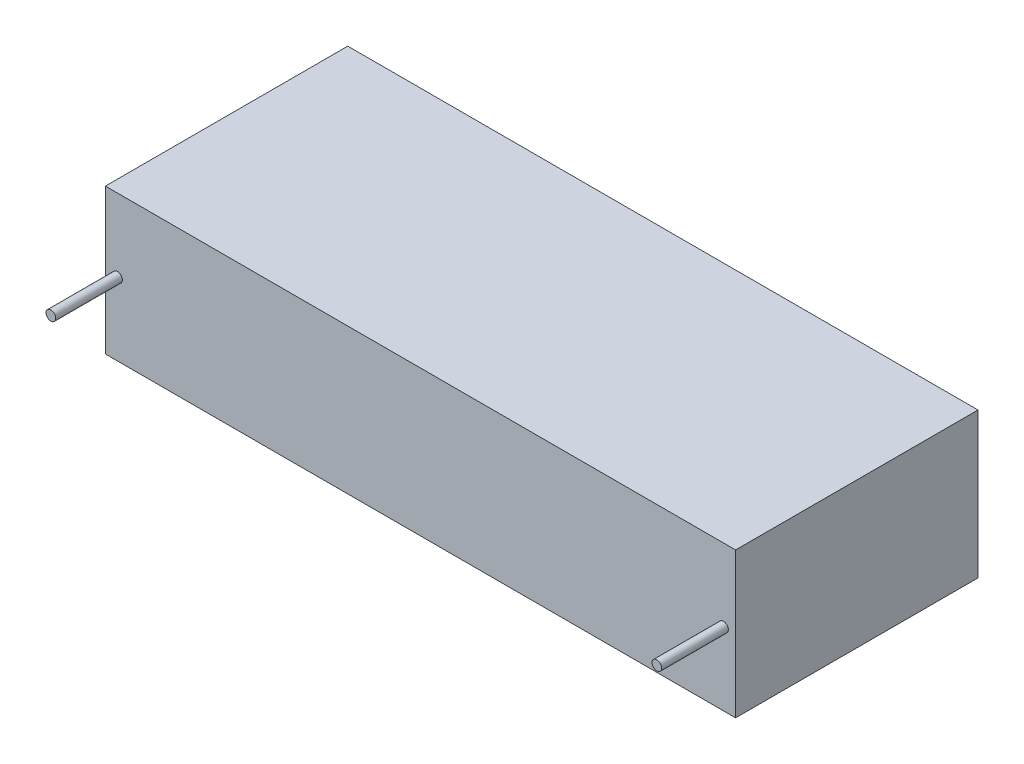
ISO-10303-21;
HEADER;
FILE_DESCRIPTION(('STEP AP214'),'2;1');
FILE_NAME('part.step','',(''),(''),'','','');
FILE_SCHEMA(('AUTOMOTIVE_DESIGN { 1 0 10303 214 1 1 1 1 }'));
ENDSEC;
DATA;
#1=APPLICATION_CONTEXT('core data for automotive mechanical design processes');
#2=APPLICATION_PROTOCOL_DEFINITION('international standard','automotive_design',2000,#1);
#3=PRODUCT_CONTEXT('',#1,'mechanical');
#4=PRODUCT('Part','Part','',(#3));
#5=PRODUCT_RELATED_PRODUCT_CATEGORY('part','',(#4));
#6=PRODUCT_DEFINITION_FORMATION('','',#4);
#7=PRODUCT_DEFINITION_CONTEXT('part definition',#1,'design');
#8=PRODUCT_DEFINITION('design','',#6,#7);
#9=PRODUCT_DEFINITION_SHAPE('','',#8);
#10=(LENGTH_UNIT() NAMED_UNIT(*) SI_UNIT(.MILLI.,.METRE.));
#11=(NAMED_UNIT(*) PLANE_ANGLE_UNIT() SI_UNIT($,.RADIAN.));
#12=(NAMED_UNIT(*) SI_UNIT($,.STERADIAN.) SOLID_ANGLE_UNIT());
#13=UNCERTAINTY_MEASURE_WITH_UNIT(LENGTH_MEASURE(1.E-05),#10,'distance_accuracy_value','');
#14=(GEOMETRIC_REPRESENTATION_CONTEXT(3) GLOBAL_UNCERTAINTY_ASSIGNED_CONTEXT((#13)) GLOBAL_UNIT_ASSIGNED_CONTEXT((#10,
#11,#12)) REPRESENTATION_CONTEXT('',''));
#15=CARTESIAN_POINT('',(0.,0.,0.));
#16=DIRECTION('',(0.,0.,1.));
#17=DIRECTION('',(1.,0.,0.));
#18=AXIS2_PLACEMENT_3D('',#15,#16,#17);
#19=CARTESIAN_POINT('',(0.,12.,20.));
#20=DIRECTION('',(0.,0.,-1.));
#21=DIRECTION('',(-1.,0.,0.));
#22=AXIS2_PLACEMENT_3D('',#19,#20,#21);
#23=PLANE('',#22);
#24=CARTESIAN_POINT('',(0.999999999999997,6.,20.));
#25=DIRECTION('',(0.,0.,-1.));
#26=DIRECTION('',(-1.,0.,0.));
#27=AXIS2_PLACEMENT_3D('',#24,#25,#26);
#28=CIRCLE('',#27,0.4);
#29=CARTESIAN_POINT('',(0.599999999999998,6.,20.));
#30=VERTEX_POINT('',#29);
#31=EDGE_CURVE('E40',#30,#30,#28,.F.);
#32=ORIENTED_EDGE('',*,*,#31,.F.);
#33=EDGE_LOOP('',(#32));
#34=FACE_BOUND('',#33,.T.);
#35=DIRECTION('',(0.,-1.,0.));
#36=VECTOR('',#35,1.);
#37=CARTESIAN_POINT('',(0.,0.,20.));
#38=LINE('',#37,#36);
#39=CARTESIAN_POINT('',(0.,12.,20.));
#40=VERTEX_POINT('',#39);
#41=CARTESIAN_POINT('',(0.,0.,20.));
#42=VERTEX_POINT('',#41);
#43=EDGE_CURVE('E84',#40,#42,#38,.T.);
#44=ORIENTED_EDGE('',*,*,#43,.T.);
#45=DIRECTION('',(1.,0.,0.));
#46=VECTOR('',#45,1.);
#47=CARTESIAN_POINT('',(0.,0.,20.));
#48=LINE('',#47,#46);
#49=CARTESIAN_POINT('',(52.,0.,20.));
#50=VERTEX_POINT('',#49);
#51=EDGE_CURVE('E79',#42,#50,#48,.T.);
#52=ORIENTED_EDGE('',*,*,#51,.T.);
#53=DIRECTION('',(0.,1.,0.));
#54=VECTOR('',#53,1.);
#55=CARTESIAN_POINT('',(52.,0.,20.));
#56=LINE('',#55,#54);
#57=CARTESIAN_POINT('',(52.,12.,20.));
#58=VERTEX_POINT('',#57);
#59=EDGE_CURVE('E82',#50,#58,#56,.T.);
#60=ORIENTED_EDGE('',*,*,#59,.T.);
#61=DIRECTION('',(-1.,0.,0.));
#62=VECTOR('',#61,1.);
#63=CARTESIAN_POINT('',(0.,12.,20.));
#64=LINE('',#63,#62);
#65=EDGE_CURVE('E48',#58,#40,#64,.T.);
#66=ORIENTED_EDGE('',*,*,#65,.T.);
#67=EDGE_LOOP('',(#44,#52,#60,#66));
#68=FACE_BOUND('',#67,.T.);
#69=CARTESIAN_POINT('',(51.,6.00000000000001,20.));
#70=DIRECTION('',(0.,0.,-1.));
#71=DIRECTION('',(-1.,0.,0.));
#72=AXIS2_PLACEMENT_3D('',#69,#70,#71);
#73=CIRCLE('',#72,0.400000000000005);
#74=CARTESIAN_POINT('',(50.6,6.00000000000001,20.));
#75=VERTEX_POINT('',#74);
#76=EDGE_CURVE('E11',#75,#75,#73,.F.);
#77=ORIENTED_EDGE('',*,*,#76,.F.);
#78=EDGE_LOOP('',(#77));
#79=FACE_BOUND('',#78,.T.);
#80=ADVANCED_FACE('F31',(#34,#68,#79),#23,.F.);
#81=CARTESIAN_POINT('',(0.,0.,20.));
#82=DIRECTION('',(1.,0.,0.));
#83=DIRECTION('',(0.,0.,-1.));
#84=AXIS2_PLACEMENT_3D('',#81,#82,#83);
#85=PLANE('',#84);
#86=DIRECTION('',(0.,-1.,0.));
#87=VECTOR('',#86,1.);
#88=CARTESIAN_POINT('',(0.,0.,0.));
#89=LINE('',#88,#87);
#90=CARTESIAN_POINT('',(0.,12.,0.));
#91=VERTEX_POINT('',#90);
#92=CARTESIAN_POINT('',(0.,0.,0.));
#93=VERTEX_POINT('',#92);
#94=EDGE_CURVE('E99',#91,#93,#89,.T.);
#95=ORIENTED_EDGE('',*,*,#94,.T.);
#96=DIRECTION('',(0.,0.,-1.));
#97=VECTOR('',#96,1.);
#98=CARTESIAN_POINT('',(0.,0.,20.));
#99=LINE('',#98,#97);
#100=EDGE_CURVE('E90',#42,#93,#99,.T.);
#101=ORIENTED_EDGE('',*,*,#100,.F.);
#102=ORIENTED_EDGE('',*,*,#43,.F.);
#103=DIRECTION('',(0.,0.,-1.));
#104=VECTOR('',#103,1.);
#105=CARTESIAN_POINT('',(0.,12.,20.));
#106=LINE('',#105,#104);
#107=EDGE_CURVE('E95',#40,#91,#106,.T.);
#108=ORIENTED_EDGE('',*,*,#107,.T.);
#109=EDGE_LOOP('',(#95,#101,#102,#108));
#110=FACE_BOUND('',#109,.T.);
#111=ADVANCED_FACE('F33',(#110),#85,.F.);
#112=CARTESIAN_POINT('',(0.,0.,20.));
#113=DIRECTION('',(0.,1.,0.));
#114=DIRECTION('',(0.,0.,1.));
#115=AXIS2_PLACEMENT_3D('',#112,#113,#114);
#116=PLANE('',#115);
#117=DIRECTION('',(1.,0.,0.));
#118=VECTOR('',#117,1.);
#119=CARTESIAN_POINT('',(0.,0.,0.));
#120=LINE('',#119,#118);
#121=CARTESIAN_POINT('',(52.,0.,0.));
#122=VERTEX_POINT('',#121);
#123=EDGE_CURVE('E89',#93,#122,#120,.T.);
#124=ORIENTED_EDGE('',*,*,#123,.T.);
#125=DIRECTION('',(0.,0.,-1.));
#126=VECTOR('',#125,1.);
#127=CARTESIAN_POINT('',(52.,0.,20.));
#128=LINE('',#127,#126);
#129=EDGE_CURVE('E87',#50,#122,#128,.T.);
#130=ORIENTED_EDGE('',*,*,#129,.F.);
#131=ORIENTED_EDGE('',*,*,#51,.F.);
#132=ORIENTED_EDGE('',*,*,#100,.T.);
#133=EDGE_LOOP('',(#124,#130,#131,#132));
#134=FACE_BOUND('',#133,.T.);
#135=ADVANCED_FACE('F88',(#134),#116,.F.);
#136=CARTESIAN_POINT('',(52.,0.,20.));
#137=DIRECTION('',(-1.,0.,0.));
#138=DIRECTION('',(0.,0.,1.));
#139=AXIS2_PLACEMENT_3D('',#136,#137,#138);
#140=PLANE('',#139);
#141=DIRECTION('',(0.,1.,0.));
#142=VECTOR('',#141,1.);
#143=CARTESIAN_POINT('',(52.,0.,0.));
#144=LINE('',#143,#142);
#145=CARTESIAN_POINT('',(52.,12.,0.));
#146=VERTEX_POINT('',#145);
#147=EDGE_CURVE('E65',#122,#146,#144,.T.);
#148=ORIENTED_EDGE('',*,*,#147,.T.);
#149=DIRECTION('',(0.,0.,-1.));
#150=VECTOR('',#149,1.);
#151=CARTESIAN_POINT('',(52.,12.,20.));
#152=LINE('',#151,#150);
#153=EDGE_CURVE('E91',#58,#146,#152,.T.);
#154=ORIENTED_EDGE('',*,*,#153,.F.);
#155=ORIENTED_EDGE('',*,*,#59,.F.);
#156=ORIENTED_EDGE('',*,*,#129,.T.);
#157=EDGE_LOOP('',(#148,#154,#155,#156));
#158=FACE_BOUND('',#157,.T.);
#159=ADVANCED_FACE('F93',(#158),#140,.F.);
#160=CARTESIAN_POINT('',(0.,12.,20.));
#161=DIRECTION('',(0.,-1.,0.));
#162=DIRECTION('',(0.,0.,-1.));
#163=AXIS2_PLACEMENT_3D('',#160,#161,#162);
#164=PLANE('',#163);
#165=DIRECTION('',(-1.,0.,0.));
#166=VECTOR('',#165,1.);
#167=CARTESIAN_POINT('',(0.,12.,0.));
#168=LINE('',#167,#166);
#169=EDGE_CURVE('E71',#146,#91,#168,.T.);
#170=ORIENTED_EDGE('',*,*,#169,.T.);
#171=ORIENTED_EDGE('',*,*,#107,.F.);
#172=ORIENTED_EDGE('',*,*,#65,.F.);
#173=ORIENTED_EDGE('',*,*,#153,.T.);
#174=EDGE_LOOP('',(#170,#171,#172,#173));
#175=FACE_BOUND('',#174,.T.);
#176=ADVANCED_FACE('F125',(#175),#164,.F.);
#177=CARTESIAN_POINT('',(0.,12.,0.));
#178=DIRECTION('',(0.,0.,-1.));
#179=DIRECTION('',(-1.,0.,0.));
#180=AXIS2_PLACEMENT_3D('',#177,#178,#179);
#181=PLANE('',#180);
#182=ORIENTED_EDGE('',*,*,#94,.F.);
#183=ORIENTED_EDGE('',*,*,#169,.F.);
#184=ORIENTED_EDGE('',*,*,#147,.F.);
#185=ORIENTED_EDGE('',*,*,#123,.F.);
#186=EDGE_LOOP('',(#182,#183,#184,#185));
#187=FACE_BOUND('',#186,.T.);
#188=ADVANCED_FACE('F122',(#187),#181,.T.);
#189=CARTESIAN_POINT('',(0.999999999999997,6.,25.5));
#190=DIRECTION('',(0.,0.,-1.));
#191=DIRECTION('',(-1.,0.,0.));
#192=AXIS2_PLACEMENT_3D('',#189,#190,#191);
#193=CYLINDRICAL_SURFACE('',#192,0.4);
#194=CARTESIAN_POINT('',(0.999999999999997,6.,25.5));
#195=DIRECTION('',(0.,0.,1.));
#196=DIRECTION('',(1.,0.,0.));
#197=AXIS2_PLACEMENT_3D('',#194,#195,#196);
#198=CIRCLE('',#197,0.4);
#199=CARTESIAN_POINT('',(1.4,6.,25.5));
#200=VERTEX_POINT('',#199);
#201=EDGE_CURVE('E102',#200,#200,#198,.T.);
#202=ORIENTED_EDGE('',*,*,#201,.F.);
#203=EDGE_LOOP('',(#202));
#204=FACE_BOUND('',#203,.T.);
#205=ORIENTED_EDGE('',*,*,#31,.T.);
#206=EDGE_LOOP('',(#205));
#207=FACE_BOUND('',#206,.T.);
#208=ADVANCED_FACE('F111',(#204,#207),#193,.T.);
#209=CARTESIAN_POINT('',(0.999999999999997,6.,25.5));
#210=DIRECTION('',(0.,0.,1.));
#211=DIRECTION('',(1.,0.,0.));
#212=AXIS2_PLACEMENT_3D('',#209,#210,#211);
#213=PLANE('',#212);
#214=ORIENTED_EDGE('',*,*,#201,.T.);
#215=EDGE_LOOP('',(#214));
#216=FACE_BOUND('',#215,.T.);
#217=ADVANCED_FACE('F153',(#216),#213,.T.);
#218=CARTESIAN_POINT('',(51.,6.00000000000001,25.5));
#219=DIRECTION('',(0.,0.,-1.));
#220=DIRECTION('',(-1.,0.,0.));
#221=AXIS2_PLACEMENT_3D('',#218,#219,#220);
#222=CYLINDRICAL_SURFACE('',#221,0.400000000000005);
#223=CARTESIAN_POINT('',(51.,6.00000000000001,25.5));
#224=DIRECTION('',(0.,0.,1.));
#225=DIRECTION('',(1.,0.,0.));
#226=AXIS2_PLACEMENT_3D('',#223,#224,#225);
#227=CIRCLE('',#226,0.400000000000005);
#228=CARTESIAN_POINT('',(51.4,6.00000000000001,25.5));
#229=VERTEX_POINT('',#228);
#230=EDGE_CURVE('E204',#229,#229,#227,.T.);
#231=ORIENTED_EDGE('',*,*,#230,.F.);
#232=EDGE_LOOP('',(#231));
#233=FACE_BOUND('',#232,.T.);
#234=ORIENTED_EDGE('',*,*,#76,.T.);
#235=EDGE_LOOP('',(#234));
#236=FACE_BOUND('',#235,.T.);
#237=ADVANCED_FACE('F160',(#233,#236),#222,.T.);
#238=CARTESIAN_POINT('',(51.,6.00000000000001,25.5));
#239=DIRECTION('',(0.,0.,1.));
#240=DIRECTION('',(1.,0.,0.));
#241=AXIS2_PLACEMENT_3D('',#238,#239,#240);
#242=PLANE('',#241);
#243=ORIENTED_EDGE('',*,*,#230,.T.);
#244=EDGE_LOOP('',(#243));
#245=FACE_BOUND('',#244,.T.);
#246=ADVANCED_FACE('F167',(#245),#242,.T.);
#247=CLOSED_SHELL('',(#80,#111,#135,#159,#176,#188,#208,#217,#237,#246));
#248=MANIFOLD_SOLID_BREP('B2',#247);
#249=ADVANCED_BREP_SHAPE_REPRESENTATION('',(#18,#248),#14);
#250=SHAPE_DEFINITION_REPRESENTATION(#9,#249);
ENDSEC;
END-ISO-10303-21;
